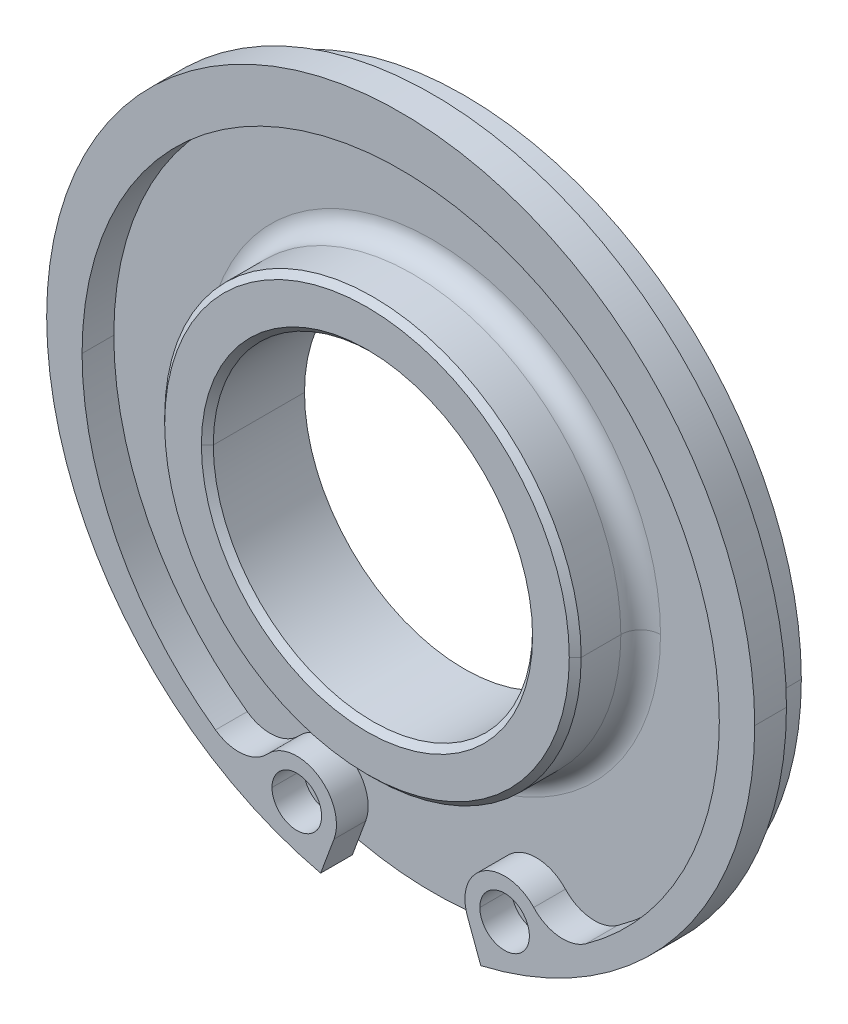
ISO-10303-21;
HEADER;
FILE_DESCRIPTION(('STEP AP214'),'2;1');
FILE_NAME('part.step','',(''),(''),'','','');
FILE_SCHEMA(('AUTOMOTIVE_DESIGN { 1 0 10303 214 1 1 1 1 }'));
ENDSEC;
DATA;
#1=APPLICATION_CONTEXT('core data for automotive mechanical design processes');
#2=APPLICATION_PROTOCOL_DEFINITION('international standard','automotive_design',2000,#1);
#3=PRODUCT_CONTEXT('',#1,'mechanical');
#4=PRODUCT('Part','Part','',(#3));
#5=PRODUCT_RELATED_PRODUCT_CATEGORY('part','',(#4));
#6=PRODUCT_DEFINITION_FORMATION('','',#4);
#7=PRODUCT_DEFINITION_CONTEXT('part definition',#1,'design');
#8=PRODUCT_DEFINITION('design','',#6,#7);
#9=PRODUCT_DEFINITION_SHAPE('','',#8);
#10=(LENGTH_UNIT() NAMED_UNIT(*) SI_UNIT(.MILLI.,.METRE.));
#11=(NAMED_UNIT(*) PLANE_ANGLE_UNIT() SI_UNIT($,.RADIAN.));
#12=(NAMED_UNIT(*) SI_UNIT($,.STERADIAN.) SOLID_ANGLE_UNIT());
#13=UNCERTAINTY_MEASURE_WITH_UNIT(LENGTH_MEASURE(1.E-05),#10,'distance_accuracy_value','');
#14=(GEOMETRIC_REPRESENTATION_CONTEXT(3) GLOBAL_UNCERTAINTY_ASSIGNED_CONTEXT((#13)) GLOBAL_UNIT_ASSIGNED_CONTEXT((#10,
#11,#12)) REPRESENTATION_CONTEXT('',''));
#15=CARTESIAN_POINT('',(0.,0.,0.));
#16=DIRECTION('',(0.,0.,1.));
#17=DIRECTION('',(1.,0.,0.));
#18=AXIS2_PLACEMENT_3D('',#15,#16,#17);
#19=CARTESIAN_POINT('',(0.,0.,40.72));
#20=DIRECTION('',(0.,0.,-1.));
#21=DIRECTION('',(-1.,0.,0.));
#22=AXIS2_PLACEMENT_3D('',#19,#20,#21);
#23=CONICAL_SURFACE('',#22,10.5,0.785398163397446);
#24=CARTESIAN_POINT('',(0.,0.,41.02));
#25=DIRECTION('',(0.,0.,1.));
#26=DIRECTION('',(-1.,0.,0.));
#27=AXIS2_PLACEMENT_3D('',#24,#25,#26);
#28=CIRCLE('',#27,10.2);
#29=CARTESIAN_POINT('',(10.2,0.,41.02));
#30=VERTEX_POINT('',#29);
#31=CARTESIAN_POINT('',(-10.2,0.,41.02));
#32=VERTEX_POINT('',#31);
#33=EDGE_CURVE('E42',#30,#32,#28,.T.);
#34=ORIENTED_EDGE('',*,*,#33,.F.);
#35=DIRECTION('',(0.707106781186546,0.,-0.70710678118655));
#36=VECTOR('',#35,1.);
#37=CARTESIAN_POINT('',(10.5,0.,40.72));
#38=LINE('',#37,#36);
#39=CARTESIAN_POINT('',(10.5,0.,40.72));
#40=VERTEX_POINT('',#39);
#41=EDGE_CURVE('E11',#30,#40,#38,.T.);
#42=ORIENTED_EDGE('',*,*,#41,.T.);
#43=CARTESIAN_POINT('',(0.,0.,40.72));
#44=DIRECTION('',(0.,0.,-1.));
#45=DIRECTION('',(-1.,0.,0.));
#46=AXIS2_PLACEMENT_3D('',#43,#44,#45);
#47=CIRCLE('',#46,10.5);
#48=CARTESIAN_POINT('',(-10.5,0.,40.72));
#49=VERTEX_POINT('',#48);
#50=EDGE_CURVE('E272',#49,#40,#47,.T.);
#51=ORIENTED_EDGE('',*,*,#50,.F.);
#52=DIRECTION('',(-0.707106781186546,0.,-0.70710678118655));
#53=VECTOR('',#52,1.);
#54=CARTESIAN_POINT('',(-10.5,0.,40.72));
#55=LINE('',#54,#53);
#56=EDGE_CURVE('E305',#32,#49,#55,.T.);
#57=ORIENTED_EDGE('',*,*,#56,.F.);
#58=EDGE_LOOP('',(#34,#42,#51,#57));
#59=FACE_BOUND('',#58,.T.);
#60=ADVANCED_FACE('F17',(#59),#23,.T.);
#61=CARTESIAN_POINT('',(0.,0.,41.02));
#62=DIRECTION('',(0.,0.,1.));
#63=DIRECTION('',(1.,0.,0.));
#64=AXIS2_PLACEMENT_3D('',#61,#62,#63);
#65=CONICAL_SURFACE('',#64,8.35,0.785398163397428);
#66=CARTESIAN_POINT('',(0.,0.,40.72));
#67=DIRECTION('',(0.,0.,1.));
#68=DIRECTION('',(-1.,0.,0.));
#69=AXIS2_PLACEMENT_3D('',#66,#67,#68);
#70=CIRCLE('',#69,8.05);
#71=CARTESIAN_POINT('',(-8.05,0.,40.72));
#72=VERTEX_POINT('',#71);
#73=CARTESIAN_POINT('',(8.05,0.,40.72));
#74=VERTEX_POINT('',#73);
#75=EDGE_CURVE('E412',#72,#74,#70,.T.);
#76=ORIENTED_EDGE('',*,*,#75,.F.);
#77=DIRECTION('',(-0.707106781186533,0.,0.707106781186562));
#78=VECTOR('',#77,1.);
#79=CARTESIAN_POINT('',(-8.35,0.,41.02));
#80=LINE('',#79,#78);
#81=CARTESIAN_POINT('',(-8.35,0.,41.02));
#82=VERTEX_POINT('',#81);
#83=EDGE_CURVE('E28',#72,#82,#80,.T.);
#84=ORIENTED_EDGE('',*,*,#83,.T.);
#85=CARTESIAN_POINT('',(0.,0.,41.02));
#86=DIRECTION('',(0.,0.,-1.));
#87=DIRECTION('',(-1.,0.,0.));
#88=AXIS2_PLACEMENT_3D('',#85,#86,#87);
#89=CIRCLE('',#88,8.35);
#90=CARTESIAN_POINT('',(8.35,0.,41.02));
#91=VERTEX_POINT('',#90);
#92=EDGE_CURVE('E428',#91,#82,#89,.T.);
#93=ORIENTED_EDGE('',*,*,#92,.F.);
#94=DIRECTION('',(0.707106781186533,0.,0.707106781186562));
#95=VECTOR('',#94,1.);
#96=CARTESIAN_POINT('',(8.35,0.,41.02));
#97=LINE('',#96,#95);
#98=EDGE_CURVE('E271',#74,#91,#97,.T.);
#99=ORIENTED_EDGE('',*,*,#98,.F.);
#100=EDGE_LOOP('',(#76,#84,#93,#99));
#101=FACE_BOUND('',#100,.T.);
#102=ADVANCED_FACE('F622',(#101),#65,.F.);
#103=CARTESIAN_POINT('',(0.,0.,38.72));
#104=DIRECTION('',(0.,0.,-1.));
#105=DIRECTION('',(-1.,0.,0.));
#106=AXIS2_PLACEMENT_3D('',#103,#104,#105);
#107=TOROIDAL_SURFACE('',#106,11.5,1.);
#108=CARTESIAN_POINT('',(0.,0.,37.72));
#109=DIRECTION('',(0.,0.,-1.));
#110=DIRECTION('',(-1.,0.,0.));
#111=AXIS2_PLACEMENT_3D('',#108,#109,#110);
#112=CIRCLE('',#111,11.5);
#113=CARTESIAN_POINT('',(11.5,0.,37.72));
#114=VERTEX_POINT('',#113);
#115=CARTESIAN_POINT('',(-11.5,0.,37.72));
#116=VERTEX_POINT('',#115);
#117=EDGE_CURVE('E443',#114,#116,#112,.T.);
#118=ORIENTED_EDGE('',*,*,#117,.F.);
#119=CARTESIAN_POINT('',(11.5,0.,38.72));
#120=DIRECTION('',(0.,1.,0.));
#121=DIRECTION('',(-1.,0.,0.));
#122=AXIS2_PLACEMENT_3D('',#119,#120,#121);
#123=CIRCLE('',#122,1.);
#124=CARTESIAN_POINT('',(10.5,0.,38.72));
#125=VERTEX_POINT('',#124);
#126=EDGE_CURVE('E227',#114,#125,#123,.T.);
#127=ORIENTED_EDGE('',*,*,#126,.T.);
#128=CARTESIAN_POINT('',(0.,0.,38.72));
#129=DIRECTION('',(0.,0.,1.));
#130=DIRECTION('',(-1.,0.,0.));
#131=AXIS2_PLACEMENT_3D('',#128,#129,#130);
#132=CIRCLE('',#131,10.5);
#133=CARTESIAN_POINT('',(-10.5,0.,38.72));
#134=VERTEX_POINT('',#133);
#135=EDGE_CURVE('E290',#134,#125,#132,.T.);
#136=ORIENTED_EDGE('',*,*,#135,.F.);
#137=CARTESIAN_POINT('',(-11.5,0.,38.72));
#138=DIRECTION('',(0.,-1.,0.));
#139=DIRECTION('',(0.,0.,-1.));
#140=AXIS2_PLACEMENT_3D('',#137,#138,#139);
#141=CIRCLE('',#140,1.);
#142=EDGE_CURVE('E266',#116,#134,#141,.T.);
#143=ORIENTED_EDGE('',*,*,#142,.F.);
#144=EDGE_LOOP('',(#118,#127,#136,#143));
#145=FACE_BOUND('',#144,.T.);
#146=ADVANCED_FACE('F627',(#145),#107,.F.);
#147=CARTESIAN_POINT('',(0.,0.,41.02));
#148=DIRECTION('',(0.,0.,-1.));
#149=DIRECTION('',(-1.,0.,0.));
#150=AXIS2_PLACEMENT_3D('',#147,#148,#149);
#151=CYLINDRICAL_SURFACE('',#150,10.5);
#152=ORIENTED_EDGE('',*,*,#50,.T.);
#153=DIRECTION('',(0.,0.,-1.));
#154=VECTOR('',#153,1.);
#155=CARTESIAN_POINT('',(10.5,0.,41.02));
#156=LINE('',#155,#154);
#157=EDGE_CURVE('E276',#40,#125,#156,.T.);
#158=ORIENTED_EDGE('',*,*,#157,.T.);
#159=CARTESIAN_POINT('',(0.,0.,38.72));
#160=DIRECTION('',(0.,0.,1.));
#161=DIRECTION('',(-1.,0.,0.));
#162=AXIS2_PLACEMENT_3D('',#159,#160,#161);
#163=CIRCLE('',#162,10.5);
#164=EDGE_CURVE('E280',#125,#134,#163,.T.);
#165=ORIENTED_EDGE('',*,*,#164,.T.);
#166=DIRECTION('',(0.,0.,-1.));
#167=VECTOR('',#166,1.);
#168=CARTESIAN_POINT('',(-10.5,0.,41.02));
#169=LINE('',#168,#167);
#170=EDGE_CURVE('E285',#49,#134,#169,.T.);
#171=ORIENTED_EDGE('',*,*,#170,.F.);
#172=EDGE_LOOP('',(#152,#158,#165,#171));
#173=FACE_BOUND('',#172,.T.);
#174=ADVANCED_FACE('F687',(#173),#151,.T.);
#175=CARTESIAN_POINT('',(0.,0.,36.12));
#176=DIRECTION('',(0.,0.,1.));
#177=DIRECTION('',(1.,0.,0.));
#178=AXIS2_PLACEMENT_3D('',#175,#176,#177);
#179=CYLINDRICAL_SURFACE('',#178,8.05);
#180=CARTESIAN_POINT('',(0.,0.,36.12));
#181=DIRECTION('',(0.,0.,-1.));
#182=DIRECTION('',(-1.,0.,0.));
#183=AXIS2_PLACEMENT_3D('',#180,#181,#182);
#184=CIRCLE('',#183,8.05);
#185=CARTESIAN_POINT('',(8.05,0.,36.12));
#186=VERTEX_POINT('',#185);
#187=CARTESIAN_POINT('',(-8.05,0.,36.12));
#188=VERTEX_POINT('',#187);
#189=EDGE_CURVE('E411',#186,#188,#184,.T.);
#190=ORIENTED_EDGE('',*,*,#189,.T.);
#191=DIRECTION('',(0.,0.,1.));
#192=VECTOR('',#191,1.);
#193=CARTESIAN_POINT('',(-8.05,0.,36.12));
#194=LINE('',#193,#192);
#195=EDGE_CURVE('E407',#188,#72,#194,.T.);
#196=ORIENTED_EDGE('',*,*,#195,.T.);
#197=ORIENTED_EDGE('',*,*,#75,.T.);
#198=DIRECTION('',(0.,0.,1.));
#199=VECTOR('',#198,1.);
#200=CARTESIAN_POINT('',(8.05,0.,36.12));
#201=LINE('',#200,#199);
#202=EDGE_CURVE('E320',#186,#74,#201,.T.);
#203=ORIENTED_EDGE('',*,*,#202,.F.);
#204=EDGE_LOOP('',(#190,#196,#197,#203));
#205=FACE_BOUND('',#204,.T.);
#206=ADVANCED_FACE('F598',(#205),#179,.F.);
#207=CARTESIAN_POINT('',(0.,0.,36.12));
#208=DIRECTION('',(0.,0.,1.));
#209=DIRECTION('',(1.,0.,0.));
#210=AXIS2_PLACEMENT_3D('',#207,#208,#209);
#211=CYLINDRICAL_SURFACE('',#210,17.);
#212=CARTESIAN_POINT('',(0.,0.,36.12));
#213=DIRECTION('',(0.,0.,-1.));
#214=DIRECTION('',(-1.,0.,0.));
#215=AXIS2_PLACEMENT_3D('',#212,#213,#214);
#216=CIRCLE('',#215,17.);
#217=CARTESIAN_POINT('',(-17.,0.,36.12));
#218=VERTEX_POINT('',#217);
#219=CARTESIAN_POINT('',(17.,0.,36.12));
#220=VERTEX_POINT('',#219);
#221=EDGE_CURVE('E466',#218,#220,#216,.T.);
#222=ORIENTED_EDGE('',*,*,#221,.F.);
#223=DIRECTION('',(0.,0.,1.));
#224=VECTOR('',#223,1.);
#225=CARTESIAN_POINT('',(-17.,0.,36.12));
#226=LINE('',#225,#224);
#227=CARTESIAN_POINT('',(-17.,0.,37.72));
#228=VERTEX_POINT('',#227);
#229=EDGE_CURVE('E461',#218,#228,#226,.T.);
#230=ORIENTED_EDGE('',*,*,#229,.T.);
#231=CARTESIAN_POINT('',(0.,0.,37.72));
#232=DIRECTION('',(0.,0.,-1.));
#233=DIRECTION('',(-1.,0.,0.));
#234=AXIS2_PLACEMENT_3D('',#231,#232,#233);
#235=CIRCLE('',#234,17.);
#236=CARTESIAN_POINT('',(17.,0.,37.72));
#237=VERTEX_POINT('',#236);
#238=EDGE_CURVE('E335',#228,#237,#235,.T.);
#239=ORIENTED_EDGE('',*,*,#238,.T.);
#240=DIRECTION('',(0.,0.,1.));
#241=VECTOR('',#240,1.);
#242=CARTESIAN_POINT('',(17.,0.,36.12));
#243=LINE('',#242,#241);
#244=EDGE_CURVE('E448',#220,#237,#243,.T.);
#245=ORIENTED_EDGE('',*,*,#244,.F.);
#246=EDGE_LOOP('',(#222,#230,#239,#245));
#247=FACE_BOUND('',#246,.T.);
#248=ADVANCED_FACE('F572',(#247),#211,.T.);
#249=CARTESIAN_POINT('',(5.23872833875617,-14.8721229126396,39.32));
#250=DIRECTION('',(0.,0.,-1.));
#251=DIRECTION('',(-1.,0.,0.));
#252=AXIS2_PLACEMENT_3D('',#249,#250,#251);
#253=CYLINDRICAL_SURFACE('',#252,1.25);
#254=CARTESIAN_POINT('',(5.23872833875617,-14.8721229126396,39.32));
#255=DIRECTION('',(0.,0.,1.));
#256=DIRECTION('',(-1.,0.,0.));
#257=AXIS2_PLACEMENT_3D('',#254,#255,#256);
#258=CIRCLE('',#257,1.25);
#259=CARTESIAN_POINT('',(3.98872833875617,-14.8721229126396,39.32));
#260=VERTEX_POINT('',#259);
#261=CARTESIAN_POINT('',(6.48872833875617,-14.8721229126396,39.32));
#262=VERTEX_POINT('',#261);
#263=EDGE_CURVE('E331',#260,#262,#258,.T.);
#264=ORIENTED_EDGE('',*,*,#263,.T.);
#265=DIRECTION('',(0.,0.,-1.));
#266=VECTOR('',#265,1.);
#267=CARTESIAN_POINT('',(6.48872833875617,-14.8721229126396,39.32));
#268=LINE('',#267,#266);
#269=CARTESIAN_POINT('',(6.48872833875617,-14.8721229126396,37.72));
#270=VERTEX_POINT('',#269);
#271=EDGE_CURVE('E336',#262,#270,#268,.T.);
#272=ORIENTED_EDGE('',*,*,#271,.T.);
#273=CARTESIAN_POINT('',(5.23872833875617,-14.8721229126396,37.72));
#274=DIRECTION('',(0.,0.,1.));
#275=DIRECTION('',(-1.,0.,0.));
#276=AXIS2_PLACEMENT_3D('',#273,#274,#275);
#277=CIRCLE('',#276,1.25);
#278=CARTESIAN_POINT('',(5.85364104476333,-15.9604162389037,37.72));
#279=VERTEX_POINT('',#278);
#280=EDGE_CURVE('E315',#279,#270,#277,.T.);
#281=ORIENTED_EDGE('',*,*,#280,.F.);
#282=CARTESIAN_POINT('',(5.23872833875617,-14.8721229126396,37.72));
#283=DIRECTION('',(0.,0.,1.));
#284=DIRECTION('',(-1.,0.,0.));
#285=AXIS2_PLACEMENT_3D('',#282,#283,#284);
#286=CIRCLE('',#285,1.25);
#287=CARTESIAN_POINT('',(5.44164286331349,-16.105543236667,37.72));
#288=VERTEX_POINT('',#287);
#289=EDGE_CURVE('E238',#288,#279,#286,.T.);
#290=ORIENTED_EDGE('',*,*,#289,.F.);
#291=CARTESIAN_POINT('',(5.23872833875617,-14.8721229126396,37.72));
#292=DIRECTION('',(0.,0.,1.));
#293=DIRECTION('',(-1.,0.,0.));
#294=AXIS2_PLACEMENT_3D('',#291,#292,#293);
#295=CIRCLE('',#294,1.25);
#296=CARTESIAN_POINT('',(3.98872833875617,-14.8721229126396,37.72));
#297=VERTEX_POINT('',#296);
#298=EDGE_CURVE('E316',#297,#288,#295,.T.);
#299=ORIENTED_EDGE('',*,*,#298,.F.);
#300=DIRECTION('',(0.,0.,-1.));
#301=VECTOR('',#300,1.);
#302=CARTESIAN_POINT('',(3.98872833875617,-14.8721229126396,39.32));
#303=LINE('',#302,#301);
#304=EDGE_CURVE('E298',#260,#297,#303,.T.);
#305=ORIENTED_EDGE('',*,*,#304,.F.);
#306=EDGE_LOOP('',(#264,#272,#281,#290,#299,#305));
#307=FACE_BOUND('',#306,.T.);
#308=ADVANCED_FACE('F756',(#307),#253,.F.);
#309=CARTESIAN_POINT('',(-5.23872833875617,-14.8721229126396,39.32));
#310=DIRECTION('',(0.,0.,-1.));
#311=DIRECTION('',(-1.,0.,0.));
#312=AXIS2_PLACEMENT_3D('',#309,#310,#311);
#313=CYLINDRICAL_SURFACE('',#312,1.25);
#314=CARTESIAN_POINT('',(-5.23872833875617,-14.8721229126396,39.32));
#315=DIRECTION('',(0.,0.,1.));
#316=DIRECTION('',(1.,0.,0.));
#317=AXIS2_PLACEMENT_3D('',#314,#315,#316);
#318=CIRCLE('',#317,1.25);
#319=CARTESIAN_POINT('',(-6.48872833875617,-14.8721229126396,39.32));
#320=VERTEX_POINT('',#319);
#321=CARTESIAN_POINT('',(-3.98872833875617,-14.8721229126396,39.32));
#322=VERTEX_POINT('',#321);
#323=EDGE_CURVE('E424',#320,#322,#318,.T.);
#324=ORIENTED_EDGE('',*,*,#323,.T.);
#325=DIRECTION('',(0.,0.,-1.));
#326=VECTOR('',#325,1.);
#327=CARTESIAN_POINT('',(-3.98872833875617,-14.8721229126396,39.32));
#328=LINE('',#327,#326);
#329=CARTESIAN_POINT('',(-3.98872833875617,-14.8721229126396,37.72));
#330=VERTEX_POINT('',#329);
#331=EDGE_CURVE('E521',#322,#330,#328,.T.);
#332=ORIENTED_EDGE('',*,*,#331,.T.);
#333=CARTESIAN_POINT('',(-5.23872833875617,-14.8721229126396,37.72));
#334=DIRECTION('',(0.,0.,1.));
#335=DIRECTION('',(1.,0.,0.));
#336=AXIS2_PLACEMENT_3D('',#333,#334,#335);
#337=CIRCLE('',#336,1.25);
#338=CARTESIAN_POINT('',(-5.44164286331349,-16.105543236667,37.72));
#339=VERTEX_POINT('',#338);
#340=EDGE_CURVE('E302',#339,#330,#337,.T.);
#341=ORIENTED_EDGE('',*,*,#340,.F.);
#342=CARTESIAN_POINT('',(-5.23872833875617,-14.8721229126396,37.72));
#343=DIRECTION('',(0.,0.,1.));
#344=DIRECTION('',(1.,0.,0.));
#345=AXIS2_PLACEMENT_3D('',#342,#343,#344);
#346=CIRCLE('',#345,1.25);
#347=CARTESIAN_POINT('',(-5.85364104476333,-15.9604162389037,37.72));
#348=VERTEX_POINT('',#347);
#349=EDGE_CURVE('E234',#348,#339,#346,.T.);
#350=ORIENTED_EDGE('',*,*,#349,.F.);
#351=CARTESIAN_POINT('',(-5.23872833875617,-14.8721229126396,37.72));
#352=DIRECTION('',(0.,0.,1.));
#353=DIRECTION('',(1.,0.,0.));
#354=AXIS2_PLACEMENT_3D('',#351,#352,#353);
#355=CIRCLE('',#354,1.25);
#356=CARTESIAN_POINT('',(-6.48872833875617,-14.8721229126396,37.72));
#357=VERTEX_POINT('',#356);
#358=EDGE_CURVE('E310',#357,#348,#355,.T.);
#359=ORIENTED_EDGE('',*,*,#358,.F.);
#360=DIRECTION('',(0.,0.,-1.));
#361=VECTOR('',#360,1.);
#362=CARTESIAN_POINT('',(-6.48872833875617,-14.8721229126396,39.32));
#363=LINE('',#362,#361);
#364=EDGE_CURVE('E218',#320,#357,#363,.T.);
#365=ORIENTED_EDGE('',*,*,#364,.F.);
#366=EDGE_LOOP('',(#324,#332,#341,#350,#359,#365));
#367=FACE_BOUND('',#366,.T.);
#368=ADVANCED_FACE('F876',(#367),#313,.F.);
#369=CARTESIAN_POINT('',(0.,0.,39.32));
#370=DIRECTION('',(0.,0.,-1.));
#371=DIRECTION('',(-1.,0.,0.));
#372=AXIS2_PLACEMENT_3D('',#369,#370,#371);
#373=CYLINDRICAL_SURFACE('',#372,17.85);
#374=CARTESIAN_POINT('',(0.,0.,39.32));
#375=DIRECTION('',(0.,0.,1.));
#376=DIRECTION('',(1.,0.,0.));
#377=AXIS2_PLACEMENT_3D('',#374,#375,#376);
#378=CIRCLE('',#377,17.85);
#379=CARTESIAN_POINT('',(17.85,0.,39.32));
#380=VERTEX_POINT('',#379);
#381=CARTESIAN_POINT('',(-17.85,0.,39.32));
#382=VERTEX_POINT('',#381);
#383=EDGE_CURVE('E262',#380,#382,#378,.T.);
#384=ORIENTED_EDGE('',*,*,#383,.F.);
#385=DIRECTION('',(0.,0.,-1.));
#386=VECTOR('',#385,1.);
#387=CARTESIAN_POINT('',(17.85,0.,39.32));
#388=LINE('',#387,#386);
#389=CARTESIAN_POINT('',(17.85,0.,37.72));
#390=VERTEX_POINT('',#389);
#391=EDGE_CURVE('E329',#380,#390,#388,.T.);
#392=ORIENTED_EDGE('',*,*,#391,.T.);
#393=CARTESIAN_POINT('',(0.,0.,37.72));
#394=DIRECTION('',(0.,0.,1.));
#395=DIRECTION('',(1.,0.,0.));
#396=AXIS2_PLACEMENT_3D('',#393,#394,#395);
#397=CIRCLE('',#396,17.85);
#398=CARTESIAN_POINT('',(-17.85,0.,37.72));
#399=VERTEX_POINT('',#398);
#400=EDGE_CURVE('E325',#390,#399,#397,.T.);
#401=ORIENTED_EDGE('',*,*,#400,.T.);
#402=DIRECTION('',(0.,0.,-1.));
#403=VECTOR('',#402,1.);
#404=CARTESIAN_POINT('',(-17.85,0.,39.32));
#405=LINE('',#404,#403);
#406=EDGE_CURVE('E330',#382,#399,#405,.T.);
#407=ORIENTED_EDGE('',*,*,#406,.F.);
#408=EDGE_LOOP('',(#384,#392,#401,#407));
#409=FACE_BOUND('',#408,.T.);
#410=ADVANCED_FACE('F745',(#409),#373,.T.);
#411=CARTESIAN_POINT('',(0.,0.,39.32));
#412=DIRECTION('',(0.,0.,-1.));
#413=DIRECTION('',(-1.,0.,0.));
#414=AXIS2_PLACEMENT_3D('',#411,#412,#413);
#415=CYLINDRICAL_SURFACE('',#414,17.85);
#416=CARTESIAN_POINT('',(0.,0.,39.32));
#417=DIRECTION('',(0.,0.,1.));
#418=DIRECTION('',(1.,0.,0.));
#419=AXIS2_PLACEMENT_3D('',#416,#417,#418);
#420=CIRCLE('',#419,17.85);
#421=CARTESIAN_POINT('',(-4.03676576682699,-17.3875536561005,39.32));
#422=VERTEX_POINT('',#421);
#423=EDGE_CURVE('E395',#382,#422,#420,.T.);
#424=ORIENTED_EDGE('',*,*,#423,.F.);
#425=ORIENTED_EDGE('',*,*,#406,.T.);
#426=CARTESIAN_POINT('',(0.,0.,37.72));
#427=DIRECTION('',(0.,0.,1.));
#428=DIRECTION('',(1.,0.,0.));
#429=AXIS2_PLACEMENT_3D('',#426,#427,#428);
#430=CIRCLE('',#429,17.85);
#431=CARTESIAN_POINT('',(-4.03676576682699,-17.3875536561005,37.72));
#432=VERTEX_POINT('',#431);
#433=EDGE_CURVE('E388',#399,#432,#430,.T.);
#434=ORIENTED_EDGE('',*,*,#433,.T.);
#435=DIRECTION('',(0.,0.,-1.));
#436=VECTOR('',#435,1.);
#437=CARTESIAN_POINT('',(-4.03676576682699,-17.3875536561005,39.32));
#438=LINE('',#437,#436);
#439=EDGE_CURVE('E228',#422,#432,#438,.T.);
#440=ORIENTED_EDGE('',*,*,#439,.F.);
#441=EDGE_LOOP('',(#424,#425,#434,#440));
#442=FACE_BOUND('',#441,.T.);
#443=ADVANCED_FACE('F741',(#442),#415,.T.);
#444=CARTESIAN_POINT('',(5.23872833875617,-14.8721229126396,39.32));
#445=DIRECTION('',(0.,0.,-1.));
#446=DIRECTION('',(-1.,0.,0.));
#447=AXIS2_PLACEMENT_3D('',#444,#445,#446);
#448=CYLINDRICAL_SURFACE('',#447,2.);
#449=CARTESIAN_POINT('',(5.23872833875617,-14.8721229126396,39.32));
#450=DIRECTION('',(0.,0.,1.));
#451=DIRECTION('',(-1.,0.,0.));
#452=AXIS2_PLACEMENT_3D('',#449,#450,#451);
#453=CIRCLE('',#452,2.);
#454=CARTESIAN_POINT('',(3.23872833875617,-14.8721229126396,39.32));
#455=VERTEX_POINT('',#454);
#456=CARTESIAN_POINT('',(3.36295046953238,-15.5659942157861,39.32));
#457=VERTEX_POINT('',#456);
#458=EDGE_CURVE('E210',#455,#457,#453,.T.);
#459=ORIENTED_EDGE('',*,*,#458,.F.);
#460=DIRECTION('',(0.,0.,-1.));
#461=VECTOR('',#460,1.);
#462=CARTESIAN_POINT('',(3.23872833875617,-14.8721229126396,39.32));
#463=LINE('',#462,#461);
#464=CARTESIAN_POINT('',(3.23872833875617,-14.8721229126396,37.72));
#465=VERTEX_POINT('',#464);
#466=EDGE_CURVE('E512',#455,#465,#463,.T.);
#467=ORIENTED_EDGE('',*,*,#466,.T.);
#468=CARTESIAN_POINT('',(5.23872833875617,-14.8721229126396,37.72));
#469=DIRECTION('',(0.,0.,1.));
#470=DIRECTION('',(-1.,0.,0.));
#471=AXIS2_PLACEMENT_3D('',#468,#469,#470);
#472=CIRCLE('',#471,2.);
#473=CARTESIAN_POINT('',(3.36295046953238,-15.5659942157861,37.72));
#474=VERTEX_POINT('',#473);
#475=EDGE_CURVE('E516',#465,#474,#472,.T.);
#476=ORIENTED_EDGE('',*,*,#475,.T.);
#477=DIRECTION('',(0.,0.,-1.));
#478=VECTOR('',#477,1.);
#479=CARTESIAN_POINT('',(3.36295046953238,-15.5659942157861,39.32));
#480=LINE('',#479,#478);
#481=EDGE_CURVE('E217',#457,#474,#480,.T.);
#482=ORIENTED_EDGE('',*,*,#481,.F.);
#483=EDGE_LOOP('',(#459,#467,#476,#482));
#484=FACE_BOUND('',#483,.T.);
#485=ADVANCED_FACE('F700',(#484),#448,.T.);
#486=CARTESIAN_POINT('',(0.,-0.71,39.32));
#487=DIRECTION('',(0.,0.,-1.));
#488=DIRECTION('',(-1.,0.,0.));
#489=AXIS2_PLACEMENT_3D('',#486,#487,#488);
#490=CYLINDRICAL_SURFACE('',#489,16.065);
#491=CARTESIAN_POINT('',(0.,-0.71,39.32));
#492=DIRECTION('',(0.,0.,-1.));
#493=DIRECTION('',(1.,0.,0.));
#494=AXIS2_PLACEMENT_3D('',#491,#492,#493);
#495=CIRCLE('',#494,16.065);
#496=CARTESIAN_POINT('',(16.065,-0.71,39.32));
#497=VERTEX_POINT('',#496);
#498=CARTESIAN_POINT('',(9.33709406812632,-13.7829835677614,39.32));
#499=VERTEX_POINT('',#498);
#500=EDGE_CURVE('E177',#497,#499,#495,.T.);
#501=ORIENTED_EDGE('',*,*,#500,.F.);
#502=DIRECTION('',(0.,0.,-1.));
#503=VECTOR('',#502,1.);
#504=CARTESIAN_POINT('',(16.065,-0.71,39.32));
#505=LINE('',#504,#503);
#506=CARTESIAN_POINT('',(16.065,-0.71,37.72));
#507=VERTEX_POINT('',#506);
#508=EDGE_CURVE('E518',#497,#507,#505,.T.);
#509=ORIENTED_EDGE('',*,*,#508,.T.);
#510=CARTESIAN_POINT('',(0.,-0.71,37.72));
#511=DIRECTION('',(0.,0.,-1.));
#512=DIRECTION('',(1.,0.,0.));
#513=AXIS2_PLACEMENT_3D('',#510,#511,#512);
#514=CIRCLE('',#513,16.065);
#515=CARTESIAN_POINT('',(9.33709406812632,-13.7829835677614,37.72));
#516=VERTEX_POINT('',#515);
#517=EDGE_CURVE('E179',#507,#516,#514,.T.);
#518=ORIENTED_EDGE('',*,*,#517,.T.);
#519=DIRECTION('',(0.,0.,-1.));
#520=VECTOR('',#519,1.);
#521=CARTESIAN_POINT('',(9.33709406812632,-13.7829835677614,39.32));
#522=LINE('',#521,#520);
#523=EDGE_CURVE('E173',#499,#516,#522,.T.);
#524=ORIENTED_EDGE('',*,*,#523,.F.);
#525=EDGE_LOOP('',(#501,#509,#518,#524));
#526=FACE_BOUND('',#525,.T.);
#527=ADVANCED_FACE('F175',(#526),#490,.F.);
#528=CARTESIAN_POINT('',(0.,-0.71,39.32));
#529=DIRECTION('',(0.,0.,-1.));
#530=DIRECTION('',(-1.,0.,0.));
#531=AXIS2_PLACEMENT_3D('',#528,#529,#530);
#532=CYLINDRICAL_SURFACE('',#531,16.065);
#533=ORIENTED_EDGE('',*,*,#508,.F.);
#534=CARTESIAN_POINT('',(0.,-0.71,39.32));
#535=DIRECTION('',(0.,0.,-1.));
#536=DIRECTION('',(1.,0.,0.));
#537=AXIS2_PLACEMENT_3D('',#534,#535,#536);
#538=CIRCLE('',#537,16.065);
#539=CARTESIAN_POINT('',(-16.065,-0.71,39.32));
#540=VERTEX_POINT('',#539);
#541=EDGE_CURVE('E198',#540,#497,#538,.T.);
#542=ORIENTED_EDGE('',*,*,#541,.F.);
#543=DIRECTION('',(0.,0.,-1.));
#544=VECTOR('',#543,1.);
#545=CARTESIAN_POINT('',(-16.065,-0.71,39.32));
#546=LINE('',#545,#544);
#547=CARTESIAN_POINT('',(-16.065,-0.71,37.72));
#548=VERTEX_POINT('',#547);
#549=EDGE_CURVE('E291',#540,#548,#546,.T.);
#550=ORIENTED_EDGE('',*,*,#549,.T.);
#551=CARTESIAN_POINT('',(0.,-0.71,37.72));
#552=DIRECTION('',(0.,0.,-1.));
#553=DIRECTION('',(1.,0.,0.));
#554=AXIS2_PLACEMENT_3D('',#551,#552,#553);
#555=CIRCLE('',#554,16.065);
#556=EDGE_CURVE('E257',#548,#507,#555,.T.);
#557=ORIENTED_EDGE('',*,*,#556,.T.);
#558=EDGE_LOOP('',(#533,#542,#550,#557));
#559=FACE_BOUND('',#558,.T.);
#560=ADVANCED_FACE('F375',(#559),#532,.F.);
#561=CARTESIAN_POINT('',(-8.1746796183129,-12.1554723859673,39.32));
#562=DIRECTION('',(0.,0.,1.));
#563=DIRECTION('',(1.,0.,0.));
#564=AXIS2_PLACEMENT_3D('',#561,#562,#563);
#565=PLANE('',#564);
#566=CARTESIAN_POINT('',(-8.1746796183129,-12.1554723859673,39.32));
#567=DIRECTION('',(0.,0.,-1.));
#568=DIRECTION('',(1.,0.,0.));
#569=AXIS2_PLACEMENT_3D('',#566,#567,#568);
#570=CIRCLE('',#569,2.);
#571=CARTESIAN_POINT('',(-6.70670397853454,-13.5137976493035,39.32));
#572=VERTEX_POINT('',#571);
#573=CARTESIAN_POINT('',(-9.33709406812633,-13.7829835677614,39.32));
#574=VERTEX_POINT('',#573);
#575=EDGE_CURVE('E254',#572,#574,#570,.T.);
#576=ORIENTED_EDGE('',*,*,#575,.T.);
#577=CARTESIAN_POINT('',(0.,-0.71,39.32));
#578=DIRECTION('',(0.,0.,-1.));
#579=DIRECTION('',(1.,0.,0.));
#580=AXIS2_PLACEMENT_3D('',#577,#578,#579);
#581=CIRCLE('',#580,16.065);
#582=EDGE_CURVE('E258',#574,#540,#581,.T.);
#583=ORIENTED_EDGE('',*,*,#582,.T.);
#584=ORIENTED_EDGE('',*,*,#541,.T.);
#585=ORIENTED_EDGE('',*,*,#500,.T.);
#586=CARTESIAN_POINT('',(8.1746796183129,-12.1554723859673,39.32));
#587=DIRECTION('',(0.,0.,-1.));
#588=DIRECTION('',(-1.,0.,0.));
#589=AXIS2_PLACEMENT_3D('',#586,#587,#588);
#590=CIRCLE('',#589,2.);
#591=CARTESIAN_POINT('',(6.70670397853454,-13.5137976493035,39.32));
#592=VERTEX_POINT('',#591);
#593=EDGE_CURVE('E195',#499,#592,#590,.T.);
#594=ORIENTED_EDGE('',*,*,#593,.T.);
#595=CARTESIAN_POINT('',(5.23872833875617,-14.8721229126396,39.32));
#596=DIRECTION('',(0.,0.,1.));
#597=DIRECTION('',(-1.,0.,0.));
#598=AXIS2_PLACEMENT_3D('',#595,#596,#597);
#599=CIRCLE('',#598,2.);
#600=EDGE_CURVE('E204',#592,#455,#599,.T.);
#601=ORIENTED_EDGE('',*,*,#600,.T.);
#602=ORIENTED_EDGE('',*,*,#458,.T.);
#603=DIRECTION('',(0.346935651573256,-0.937888934611898,0.));
#604=VECTOR('',#603,1.);
#605=CARTESIAN_POINT('',(3.36295046953237,-15.5659942157861,39.32));
#606=LINE('',#605,#604);
#607=CARTESIAN_POINT('',(4.03676576682701,-17.3875536561005,39.32));
#608=VERTEX_POINT('',#607);
#609=EDGE_CURVE('E240',#457,#608,#606,.T.);
#610=ORIENTED_EDGE('',*,*,#609,.T.);
#611=CARTESIAN_POINT('',(0.,0.,39.32));
#612=DIRECTION('',(0.,0.,1.));
#613=DIRECTION('',(1.,0.,0.));
#614=AXIS2_PLACEMENT_3D('',#611,#612,#613);
#615=CIRCLE('',#614,17.85);
#616=EDGE_CURVE('E244',#608,#380,#615,.T.);
#617=ORIENTED_EDGE('',*,*,#616,.T.);
#618=ORIENTED_EDGE('',*,*,#383,.T.);
#619=ORIENTED_EDGE('',*,*,#423,.T.);
#620=DIRECTION('',(0.346935651573256,0.937888934611898,0.));
#621=VECTOR('',#620,1.);
#622=CARTESIAN_POINT('',(-3.36295046953237,-15.5659942157861,39.32));
#623=LINE('',#622,#621);
#624=CARTESIAN_POINT('',(-3.36295046953237,-15.5659942157861,39.32));
#625=VERTEX_POINT('',#624);
#626=EDGE_CURVE('E399',#422,#625,#623,.T.);
#627=ORIENTED_EDGE('',*,*,#626,.T.);
#628=CARTESIAN_POINT('',(-5.23872833875617,-14.8721229126396,39.32));
#629=DIRECTION('',(0.,0.,1.));
#630=DIRECTION('',(1.,0.,0.));
#631=AXIS2_PLACEMENT_3D('',#628,#629,#630);
#632=CIRCLE('',#631,2.);
#633=EDGE_CURVE('E253',#625,#572,#632,.T.);
#634=ORIENTED_EDGE('',*,*,#633,.T.);
#635=EDGE_LOOP('',(#576,#583,#584,#585,#594,#601,#602,#610,#617,#618,#619,#627,#634));
#636=FACE_BOUND('',#635,.T.);
#637=ORIENTED_EDGE('',*,*,#323,.F.);
#638=CARTESIAN_POINT('',(-5.23872833875617,-14.8721229126396,39.32));
#639=DIRECTION('',(0.,0.,1.));
#640=DIRECTION('',(1.,0.,0.));
#641=AXIS2_PLACEMENT_3D('',#638,#639,#640);
#642=CIRCLE('',#641,1.25);
#643=EDGE_CURVE('E222',#322,#320,#642,.T.);
#644=ORIENTED_EDGE('',*,*,#643,.F.);
#645=EDGE_LOOP('',(#637,#644));
#646=FACE_BOUND('',#645,.T.);
#647=ORIENTED_EDGE('',*,*,#263,.F.);
#648=CARTESIAN_POINT('',(5.23872833875617,-14.8721229126396,39.32));
#649=DIRECTION('',(0.,0.,1.));
#650=DIRECTION('',(-1.,0.,0.));
#651=AXIS2_PLACEMENT_3D('',#648,#649,#650);
#652=CIRCLE('',#651,1.25);
#653=EDGE_CURVE('E223',#262,#260,#652,.T.);
#654=ORIENTED_EDGE('',*,*,#653,.F.);
#655=EDGE_LOOP('',(#647,#654));
#656=FACE_BOUND('',#655,.T.);
#657=ADVANCED_FACE('F192',(#636,#646,#656),#565,.T.);
#658=CARTESIAN_POINT('',(-8.1746796183129,-12.1554723859673,37.72));
#659=DIRECTION('',(0.,0.,1.));
#660=DIRECTION('',(1.,0.,0.));
#661=AXIS2_PLACEMENT_3D('',#658,#659,#660);
#662=PLANE('',#661);
#663=CARTESIAN_POINT('',(0.,0.,37.72));
#664=DIRECTION('',(0.,0.,-1.));
#665=DIRECTION('',(-1.,0.,0.));
#666=AXIS2_PLACEMENT_3D('',#663,#664,#665);
#667=CIRCLE('',#666,17.);
#668=CARTESIAN_POINT('',(3.73938756949013,-16.5836359283826,37.72));
#669=VERTEX_POINT('',#668);
#670=EDGE_CURVE('E413',#288,#669,#667,.T.);
#671=ORIENTED_EDGE('',*,*,#670,.F.);
#672=ORIENTED_EDGE('',*,*,#289,.T.);
#673=CARTESIAN_POINT('',(0.,0.,37.72));
#674=DIRECTION('',(0.,0.,-1.));
#675=DIRECTION('',(-1.,0.,0.));
#676=AXIS2_PLACEMENT_3D('',#673,#674,#675);
#677=CIRCLE('',#676,17.);
#678=EDGE_CURVE('E552',#237,#279,#677,.T.);
#679=ORIENTED_EDGE('',*,*,#678,.F.);
#680=ORIENTED_EDGE('',*,*,#238,.F.);
#681=CARTESIAN_POINT('',(0.,0.,37.72));
#682=DIRECTION('',(0.,0.,-1.));
#683=DIRECTION('',(-1.,0.,0.));
#684=AXIS2_PLACEMENT_3D('',#681,#682,#683);
#685=CIRCLE('',#684,17.);
#686=EDGE_CURVE('E394',#348,#228,#685,.T.);
#687=ORIENTED_EDGE('',*,*,#686,.F.);
#688=ORIENTED_EDGE('',*,*,#349,.T.);
#689=CARTESIAN_POINT('',(0.,0.,37.72));
#690=DIRECTION('',(0.,0.,-1.));
#691=DIRECTION('',(-1.,0.,0.));
#692=AXIS2_PLACEMENT_3D('',#689,#690,#691);
#693=CIRCLE('',#692,17.);
#694=CARTESIAN_POINT('',(-3.73938756949013,-16.5836359283826,37.72));
#695=VERTEX_POINT('',#694);
#696=EDGE_CURVE('E393',#695,#339,#693,.T.);
#697=ORIENTED_EDGE('',*,*,#696,.F.);
#698=DIRECTION('',(0.346935651573256,0.937888934611898,0.));
#699=VECTOR('',#698,1.);
#700=CARTESIAN_POINT('',(-3.36295046953237,-15.5659942157861,37.72));
#701=LINE('',#700,#699);
#702=EDGE_CURVE('E284',#432,#695,#701,.T.);
#703=ORIENTED_EDGE('',*,*,#702,.F.);
#704=ORIENTED_EDGE('',*,*,#433,.F.);
#705=ORIENTED_EDGE('',*,*,#400,.F.);
#706=CARTESIAN_POINT('',(0.,0.,37.72));
#707=DIRECTION('',(0.,0.,1.));
#708=DIRECTION('',(1.,0.,0.));
#709=AXIS2_PLACEMENT_3D('',#706,#707,#708);
#710=CIRCLE('',#709,17.85);
#711=CARTESIAN_POINT('',(4.03676576682701,-17.3875536561005,37.72));
#712=VERTEX_POINT('',#711);
#713=EDGE_CURVE('E442',#712,#390,#710,.T.);
#714=ORIENTED_EDGE('',*,*,#713,.F.);
#715=DIRECTION('',(0.346935651573256,-0.937888934611898,0.));
#716=VECTOR('',#715,1.);
#717=CARTESIAN_POINT('',(3.36295046953237,-15.5659942157861,37.72));
#718=LINE('',#717,#716);
#719=EDGE_CURVE('E214',#669,#712,#718,.T.);
#720=ORIENTED_EDGE('',*,*,#719,.F.);
#721=EDGE_LOOP('',(#671,#672,#679,#680,#687,#688,#697,#703,#704,#705,#714,#720));
#722=FACE_BOUND('',#721,.T.);
#723=ADVANCED_FACE('F578',(#722),#662,.F.);
#724=CARTESIAN_POINT('',(-8.1746796183129,-12.1554723859673,39.32));
#725=DIRECTION('',(0.,0.,-1.));
#726=DIRECTION('',(-1.,0.,0.));
#727=AXIS2_PLACEMENT_3D('',#724,#725,#726);
#728=CYLINDRICAL_SURFACE('',#727,2.);
#729=CARTESIAN_POINT('',(-8.1746796183129,-12.1554723859673,37.72));
#730=DIRECTION('',(0.,0.,-1.));
#731=DIRECTION('',(1.,0.,0.));
#732=AXIS2_PLACEMENT_3D('',#729,#730,#731);
#733=CIRCLE('',#732,2.);
#734=CARTESIAN_POINT('',(-6.70670397853454,-13.5137976493035,37.72));
#735=VERTEX_POINT('',#734);
#736=CARTESIAN_POINT('',(-9.33709406812633,-13.7829835677614,37.72));
#737=VERTEX_POINT('',#736);
#738=EDGE_CURVE('E239',#735,#737,#733,.T.);
#739=ORIENTED_EDGE('',*,*,#738,.T.);
#740=DIRECTION('',(0.,0.,-1.));
#741=VECTOR('',#740,1.);
#742=CARTESIAN_POINT('',(-9.33709406812633,-13.7829835677614,39.32));
#743=LINE('',#742,#741);
#744=EDGE_CURVE('E249',#574,#737,#743,.T.);
#745=ORIENTED_EDGE('',*,*,#744,.F.);
#746=ORIENTED_EDGE('',*,*,#575,.F.);
#747=DIRECTION('',(0.,0.,-1.));
#748=VECTOR('',#747,1.);
#749=CARTESIAN_POINT('',(-6.70670397853454,-13.5137976493035,39.32));
#750=LINE('',#749,#748);
#751=EDGE_CURVE('E245',#572,#735,#750,.T.);
#752=ORIENTED_EDGE('',*,*,#751,.T.);
#753=EDGE_LOOP('',(#739,#745,#746,#752));
#754=FACE_BOUND('',#753,.T.);
#755=ADVANCED_FACE('F361',(#754),#728,.F.);
#756=CARTESIAN_POINT('',(0.,-0.71,39.32));
#757=DIRECTION('',(0.,0.,-1.));
#758=DIRECTION('',(-1.,0.,0.));
#759=AXIS2_PLACEMENT_3D('',#756,#757,#758);
#760=CYLINDRICAL_SURFACE('',#759,16.065);
#761=ORIENTED_EDGE('',*,*,#549,.F.);
#762=ORIENTED_EDGE('',*,*,#582,.F.);
#763=ORIENTED_EDGE('',*,*,#744,.T.);
#764=CARTESIAN_POINT('',(0.,-0.71,37.72));
#765=DIRECTION('',(0.,0.,-1.));
#766=DIRECTION('',(1.,0.,0.));
#767=AXIS2_PLACEMENT_3D('',#764,#765,#766);
#768=CIRCLE('',#767,16.065);
#769=EDGE_CURVE('E337',#737,#548,#768,.T.);
#770=ORIENTED_EDGE('',*,*,#769,.T.);
#771=EDGE_LOOP('',(#761,#762,#763,#770));
#772=FACE_BOUND('',#771,.T.);
#773=ADVANCED_FACE('F352',(#772),#760,.F.);
#774=CARTESIAN_POINT('',(8.1746796183129,-12.1554723859673,39.32));
#775=DIRECTION('',(0.,0.,-1.));
#776=DIRECTION('',(-1.,0.,0.));
#777=AXIS2_PLACEMENT_3D('',#774,#775,#776);
#778=CYLINDRICAL_SURFACE('',#777,2.);
#779=CARTESIAN_POINT('',(8.1746796183129,-12.1554723859673,37.72));
#780=DIRECTION('',(0.,0.,-1.));
#781=DIRECTION('',(-1.,0.,0.));
#782=AXIS2_PLACEMENT_3D('',#779,#780,#781);
#783=CIRCLE('',#782,2.);
#784=CARTESIAN_POINT('',(6.70670397853454,-13.5137976493035,37.72));
#785=VERTEX_POINT('',#784);
#786=EDGE_CURVE('E185',#516,#785,#783,.T.);
#787=ORIENTED_EDGE('',*,*,#786,.T.);
#788=DIRECTION('',(0.,0.,-1.));
#789=VECTOR('',#788,1.);
#790=CARTESIAN_POINT('',(6.70670397853454,-13.5137976493035,39.32));
#791=LINE('',#790,#789);
#792=EDGE_CURVE('E186',#592,#785,#791,.T.);
#793=ORIENTED_EDGE('',*,*,#792,.F.);
#794=ORIENTED_EDGE('',*,*,#593,.F.);
#795=ORIENTED_EDGE('',*,*,#523,.T.);
#796=EDGE_LOOP('',(#787,#793,#794,#795));
#797=FACE_BOUND('',#796,.T.);
#798=ADVANCED_FACE('F201',(#797),#778,.F.);
#799=CARTESIAN_POINT('',(5.23872833875617,-14.8721229126396,39.32));
#800=DIRECTION('',(0.,0.,-1.));
#801=DIRECTION('',(-1.,0.,0.));
#802=AXIS2_PLACEMENT_3D('',#799,#800,#801);
#803=CYLINDRICAL_SURFACE('',#802,2.);
#804=ORIENTED_EDGE('',*,*,#466,.F.);
#805=ORIENTED_EDGE('',*,*,#600,.F.);
#806=ORIENTED_EDGE('',*,*,#792,.T.);
#807=CARTESIAN_POINT('',(5.23872833875617,-14.8721229126396,37.72));
#808=DIRECTION('',(0.,0.,1.));
#809=DIRECTION('',(-1.,0.,0.));
#810=AXIS2_PLACEMENT_3D('',#807,#808,#809);
#811=CIRCLE('',#810,2.);
#812=EDGE_CURVE('E400',#785,#465,#811,.T.);
#813=ORIENTED_EDGE('',*,*,#812,.T.);
#814=EDGE_LOOP('',(#804,#805,#806,#813));
#815=FACE_BOUND('',#814,.T.);
#816=ADVANCED_FACE('F718',(#815),#803,.T.);
#817=CARTESIAN_POINT('',(3.36295046953237,-15.5659942157861,39.32));
#818=DIRECTION('',(0.937888934611898,0.346935651573256,0.));
#819=DIRECTION('',(0.,0.,-1.));
#820=AXIS2_PLACEMENT_3D('',#817,#818,#819);
#821=PLANE('',#820);
#822=DIRECTION('',(0.346935651573256,-0.937888934611898,0.));
#823=VECTOR('',#822,1.);
#824=CARTESIAN_POINT('',(3.36295046953237,-15.5659942157861,37.72));
#825=LINE('',#824,#823);
#826=EDGE_CURVE('E21',#474,#669,#825,.T.);
#827=ORIENTED_EDGE('',*,*,#826,.T.);
#828=ORIENTED_EDGE('',*,*,#719,.T.);
#829=DIRECTION('',(0.,0.,-1.));
#830=VECTOR('',#829,1.);
#831=CARTESIAN_POINT('',(4.03676576682701,-17.3875536561005,39.32));
#832=LINE('',#831,#830);
#833=EDGE_CURVE('E454',#608,#712,#832,.T.);
#834=ORIENTED_EDGE('',*,*,#833,.F.);
#835=ORIENTED_EDGE('',*,*,#609,.F.);
#836=ORIENTED_EDGE('',*,*,#481,.T.);
#837=EDGE_LOOP('',(#827,#828,#834,#835,#836));
#838=FACE_BOUND('',#837,.T.);
#839=ADVANCED_FACE('F670',(#838),#821,.F.);
#840=CARTESIAN_POINT('',(0.,0.,39.32));
#841=DIRECTION('',(0.,0.,-1.));
#842=DIRECTION('',(-1.,0.,0.));
#843=AXIS2_PLACEMENT_3D('',#840,#841,#842);
#844=CYLINDRICAL_SURFACE('',#843,17.85);
#845=ORIENTED_EDGE('',*,*,#391,.F.);
#846=ORIENTED_EDGE('',*,*,#616,.F.);
#847=ORIENTED_EDGE('',*,*,#833,.T.);
#848=ORIENTED_EDGE('',*,*,#713,.T.);
#849=EDGE_LOOP('',(#845,#846,#847,#848));
#850=FACE_BOUND('',#849,.T.);
#851=ADVANCED_FACE('F642',(#850),#844,.T.);
#852=CARTESIAN_POINT('',(-3.36295046953237,-15.5659942157861,39.32));
#853=DIRECTION('',(-0.937888934611898,0.346935651573256,0.));
#854=DIRECTION('',(0.,0.,1.));
#855=AXIS2_PLACEMENT_3D('',#852,#853,#854);
#856=PLANE('',#855);
#857=ORIENTED_EDGE('',*,*,#702,.T.);
#858=DIRECTION('',(0.346935651573256,0.937888934611898,0.));
#859=VECTOR('',#858,1.);
#860=CARTESIAN_POINT('',(-3.36295046953237,-15.5659942157861,37.72));
#861=LINE('',#860,#859);
#862=CARTESIAN_POINT('',(-3.36295046953237,-15.5659942157861,37.72));
#863=VERTEX_POINT('',#862);
#864=EDGE_CURVE('E232',#695,#863,#861,.T.);
#865=ORIENTED_EDGE('',*,*,#864,.T.);
#866=DIRECTION('',(0.,0.,-1.));
#867=VECTOR('',#866,1.);
#868=CARTESIAN_POINT('',(-3.36295046953237,-15.5659942157861,39.32));
#869=LINE('',#868,#867);
#870=EDGE_CURVE('E263',#625,#863,#869,.T.);
#871=ORIENTED_EDGE('',*,*,#870,.F.);
#872=ORIENTED_EDGE('',*,*,#626,.F.);
#873=ORIENTED_EDGE('',*,*,#439,.T.);
#874=EDGE_LOOP('',(#857,#865,#871,#872,#873));
#875=FACE_BOUND('',#874,.T.);
#876=ADVANCED_FACE('F634',(#875),#856,.F.);
#877=CARTESIAN_POINT('',(-5.23872833875617,-14.8721229126396,39.32));
#878=DIRECTION('',(0.,0.,-1.));
#879=DIRECTION('',(-1.,0.,0.));
#880=AXIS2_PLACEMENT_3D('',#877,#878,#879);
#881=CYLINDRICAL_SURFACE('',#880,2.);
#882=CARTESIAN_POINT('',(-5.23872833875617,-14.8721229126396,37.72));
#883=DIRECTION('',(0.,0.,1.));
#884=DIRECTION('',(1.,0.,0.));
#885=AXIS2_PLACEMENT_3D('',#882,#883,#884);
#886=CIRCLE('',#885,2.);
#887=EDGE_CURVE('E233',#863,#735,#886,.T.);
#888=ORIENTED_EDGE('',*,*,#887,.T.);
#889=ORIENTED_EDGE('',*,*,#751,.F.);
#890=ORIENTED_EDGE('',*,*,#633,.F.);
#891=ORIENTED_EDGE('',*,*,#870,.T.);
#892=EDGE_LOOP('',(#888,#889,#890,#891));
#893=FACE_BOUND('',#892,.T.);
#894=ADVANCED_FACE('F632',(#893),#881,.T.);
#895=CARTESIAN_POINT('',(-5.23872833875617,-14.8721229126396,39.32));
#896=DIRECTION('',(0.,0.,-1.));
#897=DIRECTION('',(-1.,0.,0.));
#898=AXIS2_PLACEMENT_3D('',#895,#896,#897);
#899=CYLINDRICAL_SURFACE('',#898,1.25);
#900=ORIENTED_EDGE('',*,*,#331,.F.);
#901=ORIENTED_EDGE('',*,*,#643,.T.);
#902=ORIENTED_EDGE('',*,*,#364,.T.);
#903=CARTESIAN_POINT('',(-5.23872833875617,-14.8721229126396,37.72));
#904=DIRECTION('',(0.,0.,1.));
#905=DIRECTION('',(1.,0.,0.));
#906=AXIS2_PLACEMENT_3D('',#903,#904,#905);
#907=CIRCLE('',#906,1.25);
#908=EDGE_CURVE('E306',#330,#357,#907,.T.);
#909=ORIENTED_EDGE('',*,*,#908,.F.);
#910=EDGE_LOOP('',(#900,#901,#902,#909));
#911=FACE_BOUND('',#910,.T.);
#912=ADVANCED_FACE('F19',(#911),#899,.F.);
#913=CARTESIAN_POINT('',(5.23872833875617,-14.8721229126396,39.32));
#914=DIRECTION('',(0.,0.,-1.));
#915=DIRECTION('',(-1.,0.,0.));
#916=AXIS2_PLACEMENT_3D('',#913,#914,#915);
#917=CYLINDRICAL_SURFACE('',#916,1.25);
#918=ORIENTED_EDGE('',*,*,#271,.F.);
#919=ORIENTED_EDGE('',*,*,#653,.T.);
#920=ORIENTED_EDGE('',*,*,#304,.T.);
#921=CARTESIAN_POINT('',(5.23872833875617,-14.8721229126396,37.72));
#922=DIRECTION('',(0.,0.,1.));
#923=DIRECTION('',(-1.,0.,0.));
#924=AXIS2_PLACEMENT_3D('',#921,#922,#923);
#925=CIRCLE('',#924,1.25);
#926=EDGE_CURVE('E311',#270,#297,#925,.T.);
#927=ORIENTED_EDGE('',*,*,#926,.F.);
#928=EDGE_LOOP('',(#918,#919,#920,#927));
#929=FACE_BOUND('',#928,.T.);
#930=ADVANCED_FACE('F640',(#929),#917,.F.);
#931=CARTESIAN_POINT('',(0.,0.,37.72));
#932=DIRECTION('',(0.,0.,-1.));
#933=DIRECTION('',(0.,-1.,0.));
#934=AXIS2_PLACEMENT_3D('',#931,#932,#933);
#935=PLANE('',#934);
#936=CARTESIAN_POINT('',(0.,0.,37.72));
#937=DIRECTION('',(0.,0.,-1.));
#938=DIRECTION('',(-1.,0.,0.));
#939=AXIS2_PLACEMENT_3D('',#936,#937,#938);
#940=CIRCLE('',#939,17.);
#941=EDGE_CURVE('E389',#339,#348,#940,.T.);
#942=ORIENTED_EDGE('',*,*,#941,.F.);
#943=ORIENTED_EDGE('',*,*,#340,.T.);
#944=ORIENTED_EDGE('',*,*,#908,.T.);
#945=ORIENTED_EDGE('',*,*,#358,.T.);
#946=EDGE_LOOP('',(#942,#943,#944,#945));
#947=FACE_BOUND('',#946,.T.);
#948=ADVANCED_FACE('F617',(#947),#935,.F.);
#949=CARTESIAN_POINT('',(0.,0.,37.72));
#950=DIRECTION('',(0.,0.,-1.));
#951=DIRECTION('',(0.,-1.,0.));
#952=AXIS2_PLACEMENT_3D('',#949,#950,#951);
#953=PLANE('',#952);
#954=CARTESIAN_POINT('',(0.,0.,37.72));
#955=DIRECTION('',(0.,0.,-1.));
#956=DIRECTION('',(-1.,0.,0.));
#957=AXIS2_PLACEMENT_3D('',#954,#955,#956);
#958=CIRCLE('',#957,17.);
#959=EDGE_CURVE('E417',#279,#288,#958,.T.);
#960=ORIENTED_EDGE('',*,*,#959,.F.);
#961=ORIENTED_EDGE('',*,*,#280,.T.);
#962=ORIENTED_EDGE('',*,*,#926,.T.);
#963=ORIENTED_EDGE('',*,*,#298,.T.);
#964=EDGE_LOOP('',(#960,#961,#962,#963));
#965=FACE_BOUND('',#964,.T.);
#966=ADVANCED_FACE('F607',(#965),#953,.F.);
#967=CARTESIAN_POINT('',(0.,0.,36.12));
#968=DIRECTION('',(0.,0.,-1.));
#969=DIRECTION('',(0.,-1.,0.));
#970=AXIS2_PLACEMENT_3D('',#967,#968,#969);
#971=PLANE('',#970);
#972=CARTESIAN_POINT('',(0.,0.,36.12));
#973=DIRECTION('',(0.,0.,-1.));
#974=DIRECTION('',(-1.,0.,0.));
#975=AXIS2_PLACEMENT_3D('',#972,#973,#974);
#976=CIRCLE('',#975,17.);
#977=EDGE_CURVE('E462',#220,#218,#976,.T.);
#978=ORIENTED_EDGE('',*,*,#977,.T.);
#979=ORIENTED_EDGE('',*,*,#221,.T.);
#980=EDGE_LOOP('',(#978,#979));
#981=FACE_BOUND('',#980,.T.);
#982=ORIENTED_EDGE('',*,*,#189,.F.);
#983=CARTESIAN_POINT('',(0.,0.,36.12));
#984=DIRECTION('',(0.,0.,-1.));
#985=DIRECTION('',(-1.,0.,0.));
#986=AXIS2_PLACEMENT_3D('',#983,#984,#985);
#987=CIRCLE('',#986,8.05);
#988=EDGE_CURVE('E487',#188,#186,#987,.T.);
#989=ORIENTED_EDGE('',*,*,#988,.F.);
#990=EDGE_LOOP('',(#982,#989));
#991=FACE_BOUND('',#990,.T.);
#992=ADVANCED_FACE('F605',(#981,#991),#971,.T.);
#993=CARTESIAN_POINT('',(0.,0.,37.72));
#994=DIRECTION('',(0.,0.,-1.));
#995=DIRECTION('',(0.,-1.,0.));
#996=AXIS2_PLACEMENT_3D('',#993,#994,#995);
#997=PLANE('',#996);
#998=ORIENTED_EDGE('',*,*,#864,.F.);
#999=CARTESIAN_POINT('',(0.,0.,37.72));
#1000=DIRECTION('',(0.,0.,-1.));
#1001=DIRECTION('',(-1.,0.,0.));
#1002=AXIS2_PLACEMENT_3D('',#999,#1000,#1001);
#1003=CIRCLE('',#1002,17.);
#1004=EDGE_CURVE('E418',#669,#695,#1003,.T.);
#1005=ORIENTED_EDGE('',*,*,#1004,.F.);
#1006=ORIENTED_EDGE('',*,*,#826,.F.);
#1007=ORIENTED_EDGE('',*,*,#475,.F.);
#1008=ORIENTED_EDGE('',*,*,#812,.F.);
#1009=ORIENTED_EDGE('',*,*,#786,.F.);
#1010=ORIENTED_EDGE('',*,*,#517,.F.);
#1011=ORIENTED_EDGE('',*,*,#556,.F.);
#1012=ORIENTED_EDGE('',*,*,#769,.F.);
#1013=ORIENTED_EDGE('',*,*,#738,.F.);
#1014=ORIENTED_EDGE('',*,*,#887,.F.);
#1015=EDGE_LOOP('',(#998,#1005,#1006,#1007,#1008,#1009,#1010,#1011,#1012,#1013,#1014));
#1016=FACE_BOUND('',#1015,.T.);
#1017=CARTESIAN_POINT('',(0.,0.,37.72));
#1018=DIRECTION('',(0.,0.,-1.));
#1019=DIRECTION('',(-1.,0.,0.));
#1020=AXIS2_PLACEMENT_3D('',#1017,#1018,#1019);
#1021=CIRCLE('',#1020,11.5);
#1022=EDGE_CURVE('E447',#116,#114,#1021,.T.);
#1023=ORIENTED_EDGE('',*,*,#1022,.T.);
#1024=ORIENTED_EDGE('',*,*,#117,.T.);
#1025=EDGE_LOOP('',(#1023,#1024));
#1026=FACE_BOUND('',#1025,.T.);
#1027=ADVANCED_FACE('F369',(#1016,#1026),#997,.F.);
#1028=CARTESIAN_POINT('',(0.,0.,36.12));
#1029=DIRECTION('',(0.,0.,1.));
#1030=DIRECTION('',(1.,0.,0.));
#1031=AXIS2_PLACEMENT_3D('',#1028,#1029,#1030);
#1032=CYLINDRICAL_SURFACE('',#1031,17.);
#1033=ORIENTED_EDGE('',*,*,#229,.F.);
#1034=ORIENTED_EDGE('',*,*,#977,.F.);
#1035=ORIENTED_EDGE('',*,*,#244,.T.);
#1036=ORIENTED_EDGE('',*,*,#678,.T.);
#1037=ORIENTED_EDGE('',*,*,#959,.T.);
#1038=ORIENTED_EDGE('',*,*,#670,.T.);
#1039=ORIENTED_EDGE('',*,*,#1004,.T.);
#1040=ORIENTED_EDGE('',*,*,#696,.T.);
#1041=ORIENTED_EDGE('',*,*,#941,.T.);
#1042=ORIENTED_EDGE('',*,*,#686,.T.);
#1043=EDGE_LOOP('',(#1033,#1034,#1035,#1036,#1037,#1038,#1039,#1040,#1041,#1042));
#1044=FACE_BOUND('',#1043,.T.);
#1045=ADVANCED_FACE('F615',(#1044),#1032,.T.);
#1046=CARTESIAN_POINT('',(0.,0.,36.12));
#1047=DIRECTION('',(0.,0.,1.));
#1048=DIRECTION('',(1.,0.,0.));
#1049=AXIS2_PLACEMENT_3D('',#1046,#1047,#1048);
#1050=CYLINDRICAL_SURFACE('',#1049,8.05);
#1051=ORIENTED_EDGE('',*,*,#195,.F.);
#1052=ORIENTED_EDGE('',*,*,#988,.T.);
#1053=ORIENTED_EDGE('',*,*,#202,.T.);
#1054=CARTESIAN_POINT('',(0.,0.,40.72));
#1055=DIRECTION('',(0.,0.,1.));
#1056=DIRECTION('',(-1.,0.,0.));
#1057=AXIS2_PLACEMENT_3D('',#1054,#1055,#1056);
#1058=CIRCLE('',#1057,8.05);
#1059=EDGE_CURVE('E317',#74,#72,#1058,.T.);
#1060=ORIENTED_EDGE('',*,*,#1059,.T.);
#1061=EDGE_LOOP('',(#1051,#1052,#1053,#1060));
#1062=FACE_BOUND('',#1061,.T.);
#1063=ADVANCED_FACE('F711',(#1062),#1050,.F.);
#1064=CARTESIAN_POINT('',(0.,0.,41.02));
#1065=DIRECTION('',(0.,0.,-1.));
#1066=DIRECTION('',(-1.,0.,0.));
#1067=AXIS2_PLACEMENT_3D('',#1064,#1065,#1066);
#1068=CYLINDRICAL_SURFACE('',#1067,10.5);
#1069=ORIENTED_EDGE('',*,*,#157,.F.);
#1070=CARTESIAN_POINT('',(0.,0.,40.72));
#1071=DIRECTION('',(0.,0.,-1.));
#1072=DIRECTION('',(-1.,0.,0.));
#1073=AXIS2_PLACEMENT_3D('',#1070,#1071,#1072);
#1074=CIRCLE('',#1073,10.5);
#1075=EDGE_CURVE('E289',#40,#49,#1074,.T.);
#1076=ORIENTED_EDGE('',*,*,#1075,.T.);
#1077=ORIENTED_EDGE('',*,*,#170,.T.);
#1078=ORIENTED_EDGE('',*,*,#135,.T.);
#1079=EDGE_LOOP('',(#1069,#1076,#1077,#1078));
#1080=FACE_BOUND('',#1079,.T.);
#1081=ADVANCED_FACE('F785',(#1080),#1068,.T.);
#1082=CARTESIAN_POINT('',(0.,0.,41.02));
#1083=DIRECTION('',(0.,0.,-1.));
#1084=DIRECTION('',(0.,-1.,0.));
#1085=AXIS2_PLACEMENT_3D('',#1082,#1083,#1084);
#1086=PLANE('',#1085);
#1087=CARTESIAN_POINT('',(0.,0.,41.02));
#1088=DIRECTION('',(0.,0.,1.));
#1089=DIRECTION('',(-1.,0.,0.));
#1090=AXIS2_PLACEMENT_3D('',#1087,#1088,#1089);
#1091=CIRCLE('',#1090,10.2);
#1092=EDGE_CURVE('E427',#32,#30,#1091,.T.);
#1093=ORIENTED_EDGE('',*,*,#1092,.T.);
#1094=ORIENTED_EDGE('',*,*,#33,.T.);
#1095=EDGE_LOOP('',(#1093,#1094));
#1096=FACE_BOUND('',#1095,.T.);
#1097=ORIENTED_EDGE('',*,*,#92,.T.);
#1098=CARTESIAN_POINT('',(0.,0.,41.02));
#1099=DIRECTION('',(0.,0.,-1.));
#1100=DIRECTION('',(-1.,0.,0.));
#1101=AXIS2_PLACEMENT_3D('',#1098,#1099,#1100);
#1102=CIRCLE('',#1101,8.35);
#1103=EDGE_CURVE('E270',#82,#91,#1102,.T.);
#1104=ORIENTED_EDGE('',*,*,#1103,.T.);
#1105=EDGE_LOOP('',(#1097,#1104));
#1106=FACE_BOUND('',#1105,.T.);
#1107=ADVANCED_FACE('F843',(#1096,#1106),#1086,.F.);
#1108=CARTESIAN_POINT('',(0.,0.,38.72));
#1109=DIRECTION('',(0.,0.,-1.));
#1110=DIRECTION('',(-1.,0.,0.));
#1111=AXIS2_PLACEMENT_3D('',#1108,#1109,#1110);
#1112=TOROIDAL_SURFACE('',#1111,11.5,1.);
#1113=ORIENTED_EDGE('',*,*,#126,.F.);
#1114=ORIENTED_EDGE('',*,*,#1022,.F.);
#1115=ORIENTED_EDGE('',*,*,#142,.T.);
#1116=ORIENTED_EDGE('',*,*,#164,.F.);
#1117=EDGE_LOOP('',(#1113,#1114,#1115,#1116));
#1118=FACE_BOUND('',#1117,.T.);
#1119=ADVANCED_FACE('F851',(#1118),#1112,.F.);
#1120=CARTESIAN_POINT('',(0.,0.,41.02));
#1121=DIRECTION('',(0.,0.,1.));
#1122=DIRECTION('',(1.,0.,0.));
#1123=AXIS2_PLACEMENT_3D('',#1120,#1121,#1122);
#1124=CONICAL_SURFACE('',#1123,8.35,0.785398163397428);
#1125=ORIENTED_EDGE('',*,*,#83,.F.);
#1126=ORIENTED_EDGE('',*,*,#1059,.F.);
#1127=ORIENTED_EDGE('',*,*,#98,.T.);
#1128=ORIENTED_EDGE('',*,*,#1103,.F.);
#1129=EDGE_LOOP('',(#1125,#1126,#1127,#1128));
#1130=FACE_BOUND('',#1129,.T.);
#1131=ADVANCED_FACE('F855',(#1130),#1124,.F.);
#1132=CARTESIAN_POINT('',(0.,0.,40.72));
#1133=DIRECTION('',(0.,0.,-1.));
#1134=DIRECTION('',(-1.,0.,0.));
#1135=AXIS2_PLACEMENT_3D('',#1132,#1133,#1134);
#1136=CONICAL_SURFACE('',#1135,10.5,0.785398163397446);
#1137=ORIENTED_EDGE('',*,*,#41,.F.);
#1138=ORIENTED_EDGE('',*,*,#1092,.F.);
#1139=ORIENTED_EDGE('',*,*,#56,.T.);
#1140=ORIENTED_EDGE('',*,*,#1075,.F.);
#1141=EDGE_LOOP('',(#1137,#1138,#1139,#1140));
#1142=FACE_BOUND('',#1141,.T.);
#1143=ADVANCED_FACE('F630',(#1142),#1136,.T.);
#1144=CLOSED_SHELL('',(#60,#102,#146,#174,#206,#248,#308,#368,#410,#443,#485,#527,#560,#657,
#723,#755,#773,#798,#816,#839,#851,#876,#894,#912,#930,#948,#966,#992,#1027,#1045,#1063,#1081,
#1107,#1119,#1131,#1143));
#1145=MANIFOLD_SOLID_BREP('B1',#1144);
#1146=ADVANCED_BREP_SHAPE_REPRESENTATION('',(#18,#1145),#14);
#1147=SHAPE_DEFINITION_REPRESENTATION(#9,#1146);
ENDSEC;
END-ISO-10303-21;
